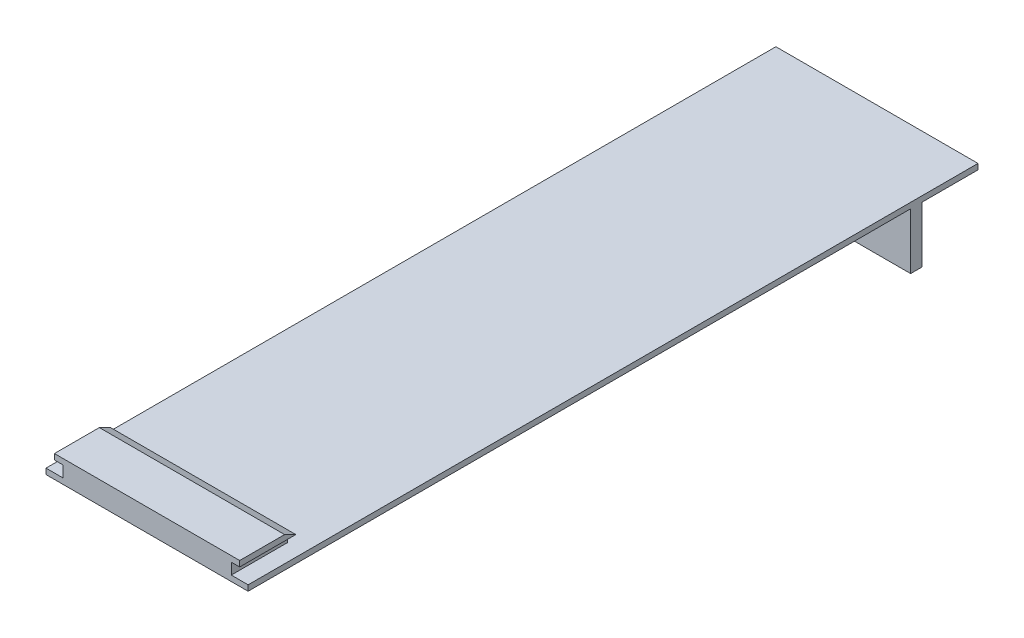
ISO-10303-21;
HEADER;
FILE_DESCRIPTION(('STEP AP214'),'2;1');
FILE_NAME('part.step','',(''),(''),'','','');
FILE_SCHEMA(('AUTOMOTIVE_DESIGN { 1 0 10303 214 1 1 1 1 }'));
ENDSEC;
DATA;
#1=APPLICATION_CONTEXT('core data for automotive mechanical design processes');
#2=APPLICATION_PROTOCOL_DEFINITION('international standard','automotive_design',2000,#1);
#3=PRODUCT_CONTEXT('',#1,'mechanical');
#4=PRODUCT('Part','Part','',(#3));
#5=PRODUCT_RELATED_PRODUCT_CATEGORY('part','',(#4));
#6=PRODUCT_DEFINITION_FORMATION('','',#4);
#7=PRODUCT_DEFINITION_CONTEXT('part definition',#1,'design');
#8=PRODUCT_DEFINITION('design','',#6,#7);
#9=PRODUCT_DEFINITION_SHAPE('','',#8);
#10=(LENGTH_UNIT() NAMED_UNIT(*) SI_UNIT(.MILLI.,.METRE.));
#11=(NAMED_UNIT(*) PLANE_ANGLE_UNIT() SI_UNIT($,.RADIAN.));
#12=(NAMED_UNIT(*) SI_UNIT($,.STERADIAN.) SOLID_ANGLE_UNIT());
#13=UNCERTAINTY_MEASURE_WITH_UNIT(LENGTH_MEASURE(1.E-05),#10,'distance_accuracy_value','');
#14=(GEOMETRIC_REPRESENTATION_CONTEXT(3) GLOBAL_UNCERTAINTY_ASSIGNED_CONTEXT((#13)) GLOBAL_UNIT_ASSIGNED_CONTEXT((#10,
#11,#12)) REPRESENTATION_CONTEXT('',''));
#15=CARTESIAN_POINT('',(0.,0.,0.));
#16=DIRECTION('',(0.,0.,1.));
#17=DIRECTION('',(1.,0.,0.));
#18=AXIS2_PLACEMENT_3D('',#15,#16,#17);
#19=CARTESIAN_POINT('',(-18.,-0.5,65.));
#20=DIRECTION('',(0.,1.,0.));
#21=DIRECTION('',(0.,0.,1.));
#22=AXIS2_PLACEMENT_3D('',#19,#20,#21);
#23=PLANE('',#22);
#24=DIRECTION('',(1.,0.,0.));
#25=VECTOR('',#24,1.);
#26=CARTESIAN_POINT('',(-18.,-0.5,-55.));
#27=LINE('',#26,#25);
#28=CARTESIAN_POINT('',(-18.,-0.5,-55.));
#29=VERTEX_POINT('',#28);
#30=CARTESIAN_POINT('',(18.,-0.5,-55.));
#31=VERTEX_POINT('',#30);
#32=EDGE_CURVE('E48',#29,#31,#27,.T.);
#33=ORIENTED_EDGE('',*,*,#32,.F.);
#34=DIRECTION('',(0.,0.,-1.));
#35=VECTOR('',#34,1.);
#36=CARTESIAN_POINT('',(-18.,-0.5,65.));
#37=LINE('',#36,#35);
#38=CARTESIAN_POINT('',(-18.,-0.5,-65.));
#39=VERTEX_POINT('',#38);
#40=EDGE_CURVE('E208',#29,#39,#37,.T.);
#41=ORIENTED_EDGE('',*,*,#40,.T.);
#42=DIRECTION('',(1.,0.,0.));
#43=VECTOR('',#42,1.);
#44=CARTESIAN_POINT('',(-18.,-0.5,-65.));
#45=LINE('',#44,#43);
#46=CARTESIAN_POINT('',(18.,-0.5,-65.));
#47=VERTEX_POINT('',#46);
#48=EDGE_CURVE('E189',#39,#47,#45,.T.);
#49=ORIENTED_EDGE('',*,*,#48,.T.);
#50=DIRECTION('',(0.,0.,-1.));
#51=VECTOR('',#50,1.);
#52=CARTESIAN_POINT('',(18.,-0.5,65.));
#53=LINE('',#52,#51);
#54=EDGE_CURVE('E53',#31,#47,#53,.T.);
#55=ORIENTED_EDGE('',*,*,#54,.F.);
#56=EDGE_LOOP('',(#33,#41,#49,#55));
#57=FACE_BOUND('',#56,.T.);
#58=ADVANCED_FACE('F33',(#57),#23,.F.);
#59=DIRECTION('',(-1.,0.,0.));
#60=VECTOR('',#59,1.);
#61=CARTESIAN_POINT('',(-18.,-0.5,-53.));
#62=LINE('',#61,#60);
#63=CARTESIAN_POINT('',(18.,-0.5,-53.));
#64=VERTEX_POINT('',#63);
#65=CARTESIAN_POINT('',(-18.,-0.5,-53.));
#66=VERTEX_POINT('',#65);
#67=EDGE_CURVE('E153',#64,#66,#62,.T.);
#68=ORIENTED_EDGE('',*,*,#67,.F.);
#69=CARTESIAN_POINT('',(18.,-0.5,65.));
#70=VERTEX_POINT('',#69);
#71=EDGE_CURVE('E205',#70,#64,#53,.T.);
#72=ORIENTED_EDGE('',*,*,#71,.F.);
#73=DIRECTION('',(1.,0.,0.));
#74=VECTOR('',#73,1.);
#75=CARTESIAN_POINT('',(-18.,-0.5,65.));
#76=LINE('',#75,#74);
#77=CARTESIAN_POINT('',(-18.,-0.5,65.));
#78=VERTEX_POINT('',#77);
#79=EDGE_CURVE('E195',#78,#70,#76,.T.);
#80=ORIENTED_EDGE('',*,*,#79,.F.);
#81=EDGE_CURVE('E209',#78,#66,#37,.T.);
#82=ORIENTED_EDGE('',*,*,#81,.T.);
#83=EDGE_LOOP('',(#68,#72,#80,#82));
#84=FACE_BOUND('',#83,.T.);
#85=ADVANCED_FACE('F320',(#84),#23,.F.);
#86=CARTESIAN_POINT('',(-18.,0.5,65.));
#87=DIRECTION('',(0.,-1.,0.));
#88=DIRECTION('',(0.,0.,-1.));
#89=AXIS2_PLACEMENT_3D('',#86,#87,#88);
#90=PLANE('',#89);
#91=DIRECTION('',(0.,0.,-1.));
#92=VECTOR('',#91,1.);
#93=CARTESIAN_POINT('',(15.,0.5,65.));
#94=LINE('',#93,#92);
#95=CARTESIAN_POINT('',(15.,0.5,65.));
#96=VERTEX_POINT('',#95);
#97=CARTESIAN_POINT('',(15.,0.5,55.));
#98=VERTEX_POINT('',#97);
#99=EDGE_CURVE('E181',#96,#98,#94,.T.);
#100=ORIENTED_EDGE('',*,*,#99,.F.);
#101=DIRECTION('',(-1.,0.,0.));
#102=VECTOR('',#101,1.);
#103=CARTESIAN_POINT('',(-18.,0.5,65.));
#104=LINE('',#103,#102);
#105=CARTESIAN_POINT('',(18.,0.5,65.));
#106=VERTEX_POINT('',#105);
#107=EDGE_CURVE('E190',#106,#96,#104,.T.);
#108=ORIENTED_EDGE('',*,*,#107,.F.);
#109=DIRECTION('',(0.,0.,-1.));
#110=VECTOR('',#109,1.);
#111=CARTESIAN_POINT('',(18.,0.5,65.));
#112=LINE('',#111,#110);
#113=CARTESIAN_POINT('',(18.,0.5,-65.));
#114=VERTEX_POINT('',#113);
#115=EDGE_CURVE('E41',#106,#114,#112,.T.);
#116=ORIENTED_EDGE('',*,*,#115,.T.);
#117=DIRECTION('',(-1.,0.,0.));
#118=VECTOR('',#117,1.);
#119=CARTESIAN_POINT('',(-18.,0.5,-65.));
#120=LINE('',#119,#118);
#121=CARTESIAN_POINT('',(-18.,0.5,-65.));
#122=VERTEX_POINT('',#121);
#123=EDGE_CURVE('E199',#114,#122,#120,.T.);
#124=ORIENTED_EDGE('',*,*,#123,.T.);
#125=DIRECTION('',(0.,0.,-1.));
#126=VECTOR('',#125,1.);
#127=CARTESIAN_POINT('',(-18.,0.5,65.));
#128=LINE('',#127,#126);
#129=CARTESIAN_POINT('',(-18.,0.5,65.));
#130=VERTEX_POINT('',#129);
#131=EDGE_CURVE('E211',#130,#122,#128,.T.);
#132=ORIENTED_EDGE('',*,*,#131,.F.);
#133=CARTESIAN_POINT('',(-15.,0.5,65.));
#134=VERTEX_POINT('',#133);
#135=EDGE_CURVE('E188',#134,#130,#104,.T.);
#136=ORIENTED_EDGE('',*,*,#135,.F.);
#137=DIRECTION('',(0.,0.,-1.));
#138=VECTOR('',#137,1.);
#139=CARTESIAN_POINT('',(-15.,0.5,65.));
#140=LINE('',#139,#138);
#141=CARTESIAN_POINT('',(-15.,0.5,55.));
#142=VERTEX_POINT('',#141);
#143=EDGE_CURVE('E237',#134,#142,#140,.T.);
#144=ORIENTED_EDGE('',*,*,#143,.T.);
#145=DIRECTION('',(1.,0.,0.));
#146=VECTOR('',#145,1.);
#147=CARTESIAN_POINT('',(15.,0.5,55.));
#148=LINE('',#147,#146);
#149=EDGE_CURVE('E263',#142,#98,#148,.T.);
#150=ORIENTED_EDGE('',*,*,#149,.T.);
#151=EDGE_LOOP('',(#100,#108,#116,#124,#132,#136,#144,#150));
#152=FACE_BOUND('',#151,.T.);
#153=ADVANCED_FACE('F217',(#152),#90,.F.);
#154=CARTESIAN_POINT('',(18.,-0.5,65.));
#155=DIRECTION('',(-1.,0.,0.));
#156=DIRECTION('',(0.,0.,1.));
#157=AXIS2_PLACEMENT_3D('',#154,#155,#156);
#158=PLANE('',#157);
#159=DIRECTION('',(0.,1.,0.));
#160=VECTOR('',#159,1.);
#161=CARTESIAN_POINT('',(18.,-0.5,-65.));
#162=LINE('',#161,#160);
#163=EDGE_CURVE('E184',#47,#114,#162,.T.);
#164=ORIENTED_EDGE('',*,*,#163,.T.);
#165=ORIENTED_EDGE('',*,*,#115,.F.);
#166=DIRECTION('',(0.,1.,0.));
#167=VECTOR('',#166,1.);
#168=CARTESIAN_POINT('',(18.,-0.5,65.));
#169=LINE('',#168,#167);
#170=EDGE_CURVE('E185',#70,#106,#169,.T.);
#171=ORIENTED_EDGE('',*,*,#170,.F.);
#172=ORIENTED_EDGE('',*,*,#71,.T.);
#173=DIRECTION('',(0.,1.,0.));
#174=VECTOR('',#173,1.);
#175=CARTESIAN_POINT('',(18.,-10.5,-53.));
#176=LINE('',#175,#174);
#177=CARTESIAN_POINT('',(18.,-10.5,-53.));
#178=VERTEX_POINT('',#177);
#179=EDGE_CURVE('E264',#178,#64,#176,.T.);
#180=ORIENTED_EDGE('',*,*,#179,.F.);
#181=DIRECTION('',(0.,0.,1.));
#182=VECTOR('',#181,1.);
#183=CARTESIAN_POINT('',(18.,-10.5,-55.));
#184=LINE('',#183,#182);
#185=CARTESIAN_POINT('',(18.,-10.5,-55.));
#186=VERTEX_POINT('',#185);
#187=EDGE_CURVE('E286',#186,#178,#184,.T.);
#188=ORIENTED_EDGE('',*,*,#187,.F.);
#189=DIRECTION('',(0.,1.,0.));
#190=VECTOR('',#189,1.);
#191=CARTESIAN_POINT('',(18.,-10.5,-55.));
#192=LINE('',#191,#190);
#193=EDGE_CURVE('E282',#186,#31,#192,.T.);
#194=ORIENTED_EDGE('',*,*,#193,.T.);
#195=ORIENTED_EDGE('',*,*,#54,.T.);
#196=EDGE_LOOP('',(#164,#165,#171,#172,#180,#188,#194,#195));
#197=FACE_BOUND('',#196,.T.);
#198=ADVANCED_FACE('F35',(#197),#158,.F.);
#199=CARTESIAN_POINT('',(-18.,-0.5,65.));
#200=DIRECTION('',(1.,0.,0.));
#201=DIRECTION('',(0.,0.,-1.));
#202=AXIS2_PLACEMENT_3D('',#199,#200,#201);
#203=PLANE('',#202);
#204=DIRECTION('',(0.,-1.,0.));
#205=VECTOR('',#204,1.);
#206=CARTESIAN_POINT('',(-18.,-0.5,-65.));
#207=LINE('',#206,#205);
#208=EDGE_CURVE('E201',#122,#39,#207,.T.);
#209=ORIENTED_EDGE('',*,*,#208,.T.);
#210=ORIENTED_EDGE('',*,*,#40,.F.);
#211=DIRECTION('',(0.,1.,0.));
#212=VECTOR('',#211,1.);
#213=CARTESIAN_POINT('',(-18.,-10.5,-55.));
#214=LINE('',#213,#212);
#215=CARTESIAN_POINT('',(-18.,-10.5,-55.));
#216=VERTEX_POINT('',#215);
#217=EDGE_CURVE('E280',#216,#29,#214,.T.);
#218=ORIENTED_EDGE('',*,*,#217,.F.);
#219=DIRECTION('',(0.,0.,-1.));
#220=VECTOR('',#219,1.);
#221=CARTESIAN_POINT('',(-18.,-10.5,-55.));
#222=LINE('',#221,#220);
#223=CARTESIAN_POINT('',(-18.,-10.5,-53.));
#224=VERTEX_POINT('',#223);
#225=EDGE_CURVE('E290',#224,#216,#222,.T.);
#226=ORIENTED_EDGE('',*,*,#225,.F.);
#227=DIRECTION('',(0.,1.,0.));
#228=VECTOR('',#227,1.);
#229=CARTESIAN_POINT('',(-18.,-10.5,-53.));
#230=LINE('',#229,#228);
#231=EDGE_CURVE('E277',#224,#66,#230,.T.);
#232=ORIENTED_EDGE('',*,*,#231,.T.);
#233=ORIENTED_EDGE('',*,*,#81,.F.);
#234=DIRECTION('',(0.,-1.,0.));
#235=VECTOR('',#234,1.);
#236=CARTESIAN_POINT('',(-18.,-0.5,65.));
#237=LINE('',#236,#235);
#238=EDGE_CURVE('E193',#130,#78,#237,.T.);
#239=ORIENTED_EDGE('',*,*,#238,.F.);
#240=ORIENTED_EDGE('',*,*,#131,.T.);
#241=EDGE_LOOP('',(#209,#210,#218,#226,#232,#233,#239,#240));
#242=FACE_BOUND('',#241,.T.);
#243=ADVANCED_FACE('F228',(#242),#203,.F.);
#244=CARTESIAN_POINT('',(0.,0.,65.));
#245=DIRECTION('',(0.,0.,-1.));
#246=DIRECTION('',(-1.,0.,0.));
#247=AXIS2_PLACEMENT_3D('',#244,#245,#246);
#248=PLANE('',#247);
#249=ORIENTED_EDGE('',*,*,#170,.T.);
#250=ORIENTED_EDGE('',*,*,#107,.T.);
#251=DIRECTION('',(0.,1.,0.));
#252=VECTOR('',#251,1.);
#253=CARTESIAN_POINT('',(15.,2.5,65.));
#254=LINE('',#253,#252);
#255=CARTESIAN_POINT('',(15.,2.5,65.));
#256=VERTEX_POINT('',#255);
#257=EDGE_CURVE('E255',#96,#256,#254,.T.);
#258=ORIENTED_EDGE('',*,*,#257,.T.);
#259=DIRECTION('',(1.,0.,0.));
#260=VECTOR('',#259,1.);
#261=CARTESIAN_POINT('',(16.5,2.5,65.));
#262=LINE('',#261,#260);
#263=CARTESIAN_POINT('',(16.5,2.5,65.));
#264=VERTEX_POINT('',#263);
#265=EDGE_CURVE('E272',#256,#264,#262,.T.);
#266=ORIENTED_EDGE('',*,*,#265,.T.);
#267=DIRECTION('',(0.,1.,0.));
#268=VECTOR('',#267,1.);
#269=CARTESIAN_POINT('',(16.5,3.5,65.));
#270=LINE('',#269,#268);
#271=CARTESIAN_POINT('',(16.5,3.5,65.));
#272=VERTEX_POINT('',#271);
#273=EDGE_CURVE('E270',#264,#272,#270,.T.);
#274=ORIENTED_EDGE('',*,*,#273,.T.);
#275=DIRECTION('',(-1.,0.,0.));
#276=VECTOR('',#275,1.);
#277=CARTESIAN_POINT('',(-16.5,3.5,65.));
#278=LINE('',#277,#276);
#279=CARTESIAN_POINT('',(-16.5,3.5,65.));
#280=VERTEX_POINT('',#279);
#281=EDGE_CURVE('E268',#272,#280,#278,.T.);
#282=ORIENTED_EDGE('',*,*,#281,.T.);
#283=DIRECTION('',(0.,-1.,0.));
#284=VECTOR('',#283,1.);
#285=CARTESIAN_POINT('',(-16.5,2.5,65.));
#286=LINE('',#285,#284);
#287=CARTESIAN_POINT('',(-16.5,2.5,65.));
#288=VERTEX_POINT('',#287);
#289=EDGE_CURVE('E167',#280,#288,#286,.T.);
#290=ORIENTED_EDGE('',*,*,#289,.T.);
#291=DIRECTION('',(1.,0.,0.));
#292=VECTOR('',#291,1.);
#293=CARTESIAN_POINT('',(-15.,2.5,65.));
#294=LINE('',#293,#292);
#295=CARTESIAN_POINT('',(-15.,2.5,65.));
#296=VERTEX_POINT('',#295);
#297=EDGE_CURVE('E243',#288,#296,#294,.T.);
#298=ORIENTED_EDGE('',*,*,#297,.T.);
#299=DIRECTION('',(0.,-1.,0.));
#300=VECTOR('',#299,1.);
#301=CARTESIAN_POINT('',(-15.,0.5,65.));
#302=LINE('',#301,#300);
#303=EDGE_CURVE('E241',#296,#134,#302,.T.);
#304=ORIENTED_EDGE('',*,*,#303,.T.);
#305=ORIENTED_EDGE('',*,*,#135,.T.);
#306=ORIENTED_EDGE('',*,*,#238,.T.);
#307=ORIENTED_EDGE('',*,*,#79,.T.);
#308=EDGE_LOOP('',(#249,#250,#258,#266,#274,#282,#290,#298,#304,#305,#306,#307));
#309=FACE_BOUND('',#308,.T.);
#310=ADVANCED_FACE('F239',(#309),#248,.F.);
#311=CARTESIAN_POINT('',(0.,0.,-65.));
#312=DIRECTION('',(0.,0.,-1.));
#313=DIRECTION('',(-1.,0.,0.));
#314=AXIS2_PLACEMENT_3D('',#311,#312,#313);
#315=PLANE('',#314);
#316=ORIENTED_EDGE('',*,*,#163,.F.);
#317=ORIENTED_EDGE('',*,*,#48,.F.);
#318=ORIENTED_EDGE('',*,*,#208,.F.);
#319=ORIENTED_EDGE('',*,*,#123,.F.);
#320=EDGE_LOOP('',(#316,#317,#318,#319));
#321=FACE_BOUND('',#320,.T.);
#322=ADVANCED_FACE('F225',(#321),#315,.T.);
#323=CARTESIAN_POINT('',(15.,2.5,65.));
#324=DIRECTION('',(-1.,0.,0.));
#325=DIRECTION('',(0.,0.,1.));
#326=AXIS2_PLACEMENT_3D('',#323,#324,#325);
#327=PLANE('',#326);
#328=DIRECTION('',(0.,1.,0.));
#329=VECTOR('',#328,1.);
#330=CARTESIAN_POINT('',(15.,2.5,55.));
#331=LINE('',#330,#329);
#332=CARTESIAN_POINT('',(15.,2.5,55.));
#333=VERTEX_POINT('',#332);
#334=EDGE_CURVE('E260',#98,#333,#331,.T.);
#335=ORIENTED_EDGE('',*,*,#334,.T.);
#336=DIRECTION('',(0.,0.,-1.));
#337=VECTOR('',#336,1.);
#338=CARTESIAN_POINT('',(15.,2.5,65.));
#339=LINE('',#338,#337);
#340=EDGE_CURVE('E178',#256,#333,#339,.T.);
#341=ORIENTED_EDGE('',*,*,#340,.F.);
#342=ORIENTED_EDGE('',*,*,#257,.F.);
#343=ORIENTED_EDGE('',*,*,#99,.T.);
#344=EDGE_LOOP('',(#335,#341,#342,#343));
#345=FACE_BOUND('',#344,.T.);
#346=ADVANCED_FACE('F306',(#345),#327,.F.);
#347=CARTESIAN_POINT('',(16.5,2.5,65.));
#348=DIRECTION('',(0.,1.,0.));
#349=DIRECTION('',(0.,0.,1.));
#350=AXIS2_PLACEMENT_3D('',#347,#348,#349);
#351=PLANE('',#350);
#352=DIRECTION('',(1.,0.,0.));
#353=VECTOR('',#352,1.);
#354=CARTESIAN_POINT('',(16.5,2.5,55.));
#355=LINE('',#354,#353);
#356=CARTESIAN_POINT('',(16.5,2.5,55.));
#357=VERTEX_POINT('',#356);
#358=EDGE_CURVE('E257',#333,#357,#355,.T.);
#359=ORIENTED_EDGE('',*,*,#358,.T.);
#360=DIRECTION('',(0.,0.,-1.));
#361=VECTOR('',#360,1.);
#362=CARTESIAN_POINT('',(16.5,2.5,65.));
#363=LINE('',#362,#361);
#364=EDGE_CURVE('E170',#264,#357,#363,.T.);
#365=ORIENTED_EDGE('',*,*,#364,.F.);
#366=ORIENTED_EDGE('',*,*,#265,.F.);
#367=ORIENTED_EDGE('',*,*,#340,.T.);
#368=EDGE_LOOP('',(#359,#365,#366,#367));
#369=FACE_BOUND('',#368,.T.);
#370=ADVANCED_FACE('F300',(#369),#351,.F.);
#371=CARTESIAN_POINT('',(16.5,3.5,65.));
#372=DIRECTION('',(-1.,0.,0.));
#373=DIRECTION('',(0.,0.,1.));
#374=AXIS2_PLACEMENT_3D('',#371,#372,#373);
#375=PLANE('',#374);
#376=ORIENTED_EDGE('',*,*,#364,.T.);
#377=DIRECTION('',(0.,-0.447213595499958,-0.894427190999916));
#378=VECTOR('',#377,1.);
#379=CARTESIAN_POINT('',(16.5,3.5,57.));
#380=LINE('',#379,#378);
#381=CARTESIAN_POINT('',(16.5,3.5,57.));
#382=VERTEX_POINT('',#381);
#383=EDGE_CURVE('E164',#382,#357,#380,.T.);
#384=ORIENTED_EDGE('',*,*,#383,.F.);
#385=DIRECTION('',(0.,0.,-1.));
#386=VECTOR('',#385,1.);
#387=CARTESIAN_POINT('',(16.5,3.5,65.));
#388=LINE('',#387,#386);
#389=EDGE_CURVE('E163',#272,#382,#388,.T.);
#390=ORIENTED_EDGE('',*,*,#389,.F.);
#391=ORIENTED_EDGE('',*,*,#273,.F.);
#392=EDGE_LOOP('',(#376,#384,#390,#391));
#393=FACE_BOUND('',#392,.T.);
#394=ADVANCED_FACE('F304',(#393),#375,.F.);
#395=CARTESIAN_POINT('',(-16.5,3.5,65.));
#396=DIRECTION('',(0.,-1.,0.));
#397=DIRECTION('',(0.,0.,-1.));
#398=AXIS2_PLACEMENT_3D('',#395,#396,#397);
#399=PLANE('',#398);
#400=ORIENTED_EDGE('',*,*,#389,.T.);
#401=DIRECTION('',(1.,0.,0.));
#402=VECTOR('',#401,1.);
#403=CARTESIAN_POINT('',(-18.001,3.5,57.));
#404=LINE('',#403,#402);
#405=CARTESIAN_POINT('',(-16.5,3.5,57.));
#406=VERTEX_POINT('',#405);
#407=EDGE_CURVE('E145',#406,#382,#404,.T.);
#408=ORIENTED_EDGE('',*,*,#407,.F.);
#409=DIRECTION('',(0.,0.,-1.));
#410=VECTOR('',#409,1.);
#411=CARTESIAN_POINT('',(-16.5,3.5,65.));
#412=LINE('',#411,#410);
#413=EDGE_CURVE('E160',#280,#406,#412,.T.);
#414=ORIENTED_EDGE('',*,*,#413,.F.);
#415=ORIENTED_EDGE('',*,*,#281,.F.);
#416=EDGE_LOOP('',(#400,#408,#414,#415));
#417=FACE_BOUND('',#416,.T.);
#418=ADVANCED_FACE('F158',(#417),#399,.F.);
#419=CARTESIAN_POINT('',(-16.5,2.5,65.));
#420=DIRECTION('',(1.,0.,0.));
#421=DIRECTION('',(0.,0.,-1.));
#422=AXIS2_PLACEMENT_3D('',#419,#420,#421);
#423=PLANE('',#422);
#424=ORIENTED_EDGE('',*,*,#413,.T.);
#425=DIRECTION('',(0.,0.447213595499958,0.894427190999916));
#426=VECTOR('',#425,1.);
#427=CARTESIAN_POINT('',(-16.5,3.5,57.));
#428=LINE('',#427,#426);
#429=CARTESIAN_POINT('',(-16.5,2.5,55.));
#430=VERTEX_POINT('',#429);
#431=EDGE_CURVE('E142',#430,#406,#428,.T.);
#432=ORIENTED_EDGE('',*,*,#431,.F.);
#433=DIRECTION('',(0.,0.,-1.));
#434=VECTOR('',#433,1.);
#435=CARTESIAN_POINT('',(-16.5,2.5,65.));
#436=LINE('',#435,#434);
#437=EDGE_CURVE('E168',#288,#430,#436,.T.);
#438=ORIENTED_EDGE('',*,*,#437,.F.);
#439=ORIENTED_EDGE('',*,*,#289,.F.);
#440=EDGE_LOOP('',(#424,#432,#438,#439));
#441=FACE_BOUND('',#440,.T.);
#442=ADVANCED_FACE('F166',(#441),#423,.F.);
#443=CARTESIAN_POINT('',(-15.,2.5,65.));
#444=DIRECTION('',(0.,1.,0.));
#445=DIRECTION('',(0.,0.,1.));
#446=AXIS2_PLACEMENT_3D('',#443,#444,#445);
#447=PLANE('',#446);
#448=DIRECTION('',(1.,0.,0.));
#449=VECTOR('',#448,1.);
#450=CARTESIAN_POINT('',(-15.,2.5,55.));
#451=LINE('',#450,#449);
#452=CARTESIAN_POINT('',(-15.,2.5,55.));
#453=VERTEX_POINT('',#452);
#454=EDGE_CURVE('E148',#430,#453,#451,.T.);
#455=ORIENTED_EDGE('',*,*,#454,.T.);
#456=DIRECTION('',(0.,0.,-1.));
#457=VECTOR('',#456,1.);
#458=CARTESIAN_POINT('',(-15.,2.5,65.));
#459=LINE('',#458,#457);
#460=EDGE_CURVE('E172',#296,#453,#459,.T.);
#461=ORIENTED_EDGE('',*,*,#460,.F.);
#462=ORIENTED_EDGE('',*,*,#297,.F.);
#463=ORIENTED_EDGE('',*,*,#437,.T.);
#464=EDGE_LOOP('',(#455,#461,#462,#463));
#465=FACE_BOUND('',#464,.T.);
#466=ADVANCED_FACE('F310',(#465),#447,.F.);
#467=CARTESIAN_POINT('',(-15.,0.5,65.));
#468=DIRECTION('',(1.,0.,0.));
#469=DIRECTION('',(0.,0.,-1.));
#470=AXIS2_PLACEMENT_3D('',#467,#468,#469);
#471=PLANE('',#470);
#472=DIRECTION('',(0.,-1.,0.));
#473=VECTOR('',#472,1.);
#474=CARTESIAN_POINT('',(-15.,0.5,55.));
#475=LINE('',#474,#473);
#476=EDGE_CURVE('E251',#453,#142,#475,.T.);
#477=ORIENTED_EDGE('',*,*,#476,.T.);
#478=ORIENTED_EDGE('',*,*,#143,.F.);
#479=ORIENTED_EDGE('',*,*,#303,.F.);
#480=ORIENTED_EDGE('',*,*,#460,.T.);
#481=EDGE_LOOP('',(#477,#478,#479,#480));
#482=FACE_BOUND('',#481,.T.);
#483=ADVANCED_FACE('F249',(#482),#471,.F.);
#484=CARTESIAN_POINT('',(0.,0.,55.));
#485=DIRECTION('',(0.,0.,-1.));
#486=DIRECTION('',(-1.,0.,0.));
#487=AXIS2_PLACEMENT_3D('',#484,#485,#486);
#488=PLANE('',#487);
#489=DIRECTION('',(-1.,0.,0.));
#490=VECTOR('',#489,1.);
#491=CARTESIAN_POINT('',(0.,2.5,55.));
#492=LINE('',#491,#490);
#493=EDGE_CURVE('E11',#333,#453,#492,.T.);
#494=ORIENTED_EDGE('',*,*,#493,.F.);
#495=ORIENTED_EDGE('',*,*,#334,.F.);
#496=ORIENTED_EDGE('',*,*,#149,.F.);
#497=ORIENTED_EDGE('',*,*,#476,.F.);
#498=EDGE_LOOP('',(#494,#495,#496,#497));
#499=FACE_BOUND('',#498,.T.);
#500=ADVANCED_FACE('F308',(#499),#488,.T.);
#501=CARTESIAN_POINT('',(-18.,-10.5,-53.));
#502=DIRECTION('',(0.,0.,-1.));
#503=DIRECTION('',(-1.,0.,0.));
#504=AXIS2_PLACEMENT_3D('',#501,#502,#503);
#505=PLANE('',#504);
#506=ORIENTED_EDGE('',*,*,#67,.T.);
#507=ORIENTED_EDGE('',*,*,#231,.F.);
#508=DIRECTION('',(-1.,0.,0.));
#509=VECTOR('',#508,1.);
#510=CARTESIAN_POINT('',(-18.,-10.5,-53.));
#511=LINE('',#510,#509);
#512=EDGE_CURVE('E292',#178,#224,#511,.T.);
#513=ORIENTED_EDGE('',*,*,#512,.F.);
#514=ORIENTED_EDGE('',*,*,#179,.T.);
#515=EDGE_LOOP('',(#506,#507,#513,#514));
#516=FACE_BOUND('',#515,.T.);
#517=ADVANCED_FACE('F400',(#516),#505,.F.);
#518=CARTESIAN_POINT('',(-18.,-10.5,-55.));
#519=DIRECTION('',(0.,0.,1.));
#520=DIRECTION('',(1.,0.,0.));
#521=AXIS2_PLACEMENT_3D('',#518,#519,#520);
#522=PLANE('',#521);
#523=ORIENTED_EDGE('',*,*,#32,.T.);
#524=ORIENTED_EDGE('',*,*,#193,.F.);
#525=DIRECTION('',(1.,0.,0.));
#526=VECTOR('',#525,1.);
#527=CARTESIAN_POINT('',(-18.,-10.5,-55.));
#528=LINE('',#527,#526);
#529=EDGE_CURVE('E284',#216,#186,#528,.T.);
#530=ORIENTED_EDGE('',*,*,#529,.F.);
#531=ORIENTED_EDGE('',*,*,#217,.T.);
#532=EDGE_LOOP('',(#523,#524,#530,#531));
#533=FACE_BOUND('',#532,.T.);
#534=ADVANCED_FACE('F419',(#533),#522,.F.);
#535=CARTESIAN_POINT('',(0.,-10.5,0.));
#536=DIRECTION('',(0.,1.,0.));
#537=DIRECTION('',(0.,0.,1.));
#538=AXIS2_PLACEMENT_3D('',#535,#536,#537);
#539=PLANE('',#538);
#540=ORIENTED_EDGE('',*,*,#187,.T.);
#541=ORIENTED_EDGE('',*,*,#512,.T.);
#542=ORIENTED_EDGE('',*,*,#225,.T.);
#543=ORIENTED_EDGE('',*,*,#529,.T.);
#544=EDGE_LOOP('',(#540,#541,#542,#543));
#545=FACE_BOUND('',#544,.T.);
#546=ADVANCED_FACE('F410',(#545),#539,.F.);
#547=CARTESIAN_POINT('',(-18.001,3.5,57.));
#548=DIRECTION('',(0.,-0.894427190999916,0.447213595499958));
#549=DIRECTION('',(0.,-0.447213595499958,-0.894427190999916));
#550=AXIS2_PLACEMENT_3D('',#547,#548,#549);
#551=PLANE('',#550);
#552=ORIENTED_EDGE('',*,*,#431,.T.);
#553=ORIENTED_EDGE('',*,*,#407,.T.);
#554=ORIENTED_EDGE('',*,*,#383,.T.);
#555=ORIENTED_EDGE('',*,*,#358,.F.);
#556=ORIENTED_EDGE('',*,*,#493,.T.);
#557=ORIENTED_EDGE('',*,*,#454,.F.);
#558=EDGE_LOOP('',(#552,#553,#554,#555,#556,#557));
#559=FACE_BOUND('',#558,.T.);
#560=ADVANCED_FACE('F144',(#559),#551,.F.);
#561=CLOSED_SHELL('',(#58,#85,#153,#198,#243,#310,#322,#346,#370,#394,#418,#442,#466,#483,#500,
#517,#534,#546,#560));
#562=MANIFOLD_SOLID_BREP('B2',#561);
#563=ADVANCED_BREP_SHAPE_REPRESENTATION('',(#18,#562),#14);
#564=SHAPE_DEFINITION_REPRESENTATION(#9,#563);
ENDSEC;
END-ISO-10303-21;
